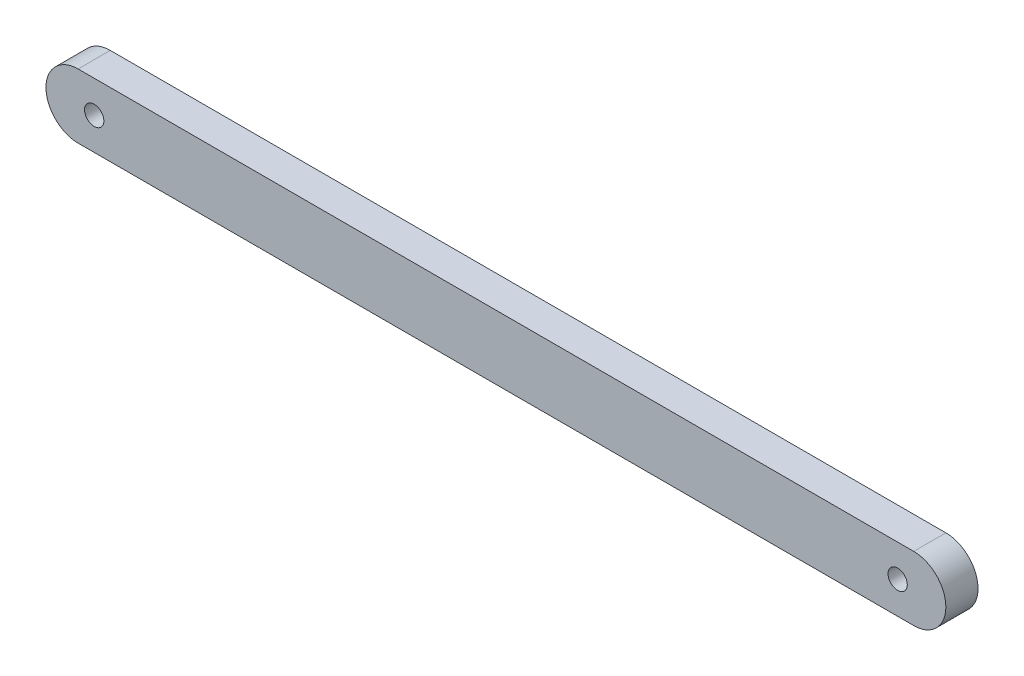
ISO-10303-21;
HEADER;
FILE_DESCRIPTION(('STEP AP214'),'2;1');
FILE_NAME('part.step','',(''),(''),'','','');
FILE_SCHEMA(('AUTOMOTIVE_DESIGN { 1 0 10303 214 1 1 1 1 }'));
ENDSEC;
DATA;
#1=APPLICATION_CONTEXT('core data for automotive mechanical design processes');
#2=APPLICATION_PROTOCOL_DEFINITION('international standard','automotive_design',2000,#1);
#3=PRODUCT_CONTEXT('',#1,'mechanical');
#4=PRODUCT('Part','Part','',(#3));
#5=PRODUCT_RELATED_PRODUCT_CATEGORY('part','',(#4));
#6=PRODUCT_DEFINITION_FORMATION('','',#4);
#7=PRODUCT_DEFINITION_CONTEXT('part definition',#1,'design');
#8=PRODUCT_DEFINITION('design','',#6,#7);
#9=PRODUCT_DEFINITION_SHAPE('','',#8);
#10=(LENGTH_UNIT() NAMED_UNIT(*) SI_UNIT(.MILLI.,.METRE.));
#11=(NAMED_UNIT(*) PLANE_ANGLE_UNIT() SI_UNIT($,.RADIAN.));
#12=(NAMED_UNIT(*) SI_UNIT($,.STERADIAN.) SOLID_ANGLE_UNIT());
#13=UNCERTAINTY_MEASURE_WITH_UNIT(LENGTH_MEASURE(1.E-05),#10,'distance_accuracy_value','');
#14=(GEOMETRIC_REPRESENTATION_CONTEXT(3) GLOBAL_UNCERTAINTY_ASSIGNED_CONTEXT((#13)) GLOBAL_UNIT_ASSIGNED_CONTEXT((#10,
#11,#12)) REPRESENTATION_CONTEXT('',''));
#15=CARTESIAN_POINT('',(0.,0.,0.));
#16=DIRECTION('',(0.,0.,1.));
#17=DIRECTION('',(1.,0.,0.));
#18=AXIS2_PLACEMENT_3D('',#15,#16,#17);
#19=CARTESIAN_POINT('',(-122.628083491461,-18.2258064516129,10.));
#20=DIRECTION('',(0.,0.,-1.));
#21=DIRECTION('',(-1.,0.,0.));
#22=AXIS2_PLACEMENT_3D('',#19,#20,#21);
#23=PLANE('',#22);
#24=CARTESIAN_POINT('',(-122.628083491461,-18.2258064516129,10.));
#25=DIRECTION('',(0.,0.,1.));
#26=DIRECTION('',(-1.,0.,0.));
#27=AXIS2_PLACEMENT_3D('',#24,#25,#26);
#28=CIRCLE('',#27,10.);
#29=CARTESIAN_POINT('',(-122.628083491461,-8.22580645161288,10.));
#30=VERTEX_POINT('',#29);
#31=CARTESIAN_POINT('',(-122.628083491461,-28.2258064516129,10.));
#32=VERTEX_POINT('',#31);
#33=EDGE_CURVE('E85',#30,#32,#28,.T.);
#34=ORIENTED_EDGE('',*,*,#33,.T.);
#35=DIRECTION('',(1.,0.,0.));
#36=VECTOR('',#35,1.);
#37=CARTESIAN_POINT('',(-122.628083491461,-28.2258064516129,10.));
#38=LINE('',#37,#36);
#39=CARTESIAN_POINT('',(137.371916508539,-28.2258064516129,10.));
#40=VERTEX_POINT('',#39);
#41=EDGE_CURVE('E80',#32,#40,#38,.T.);
#42=ORIENTED_EDGE('',*,*,#41,.T.);
#43=CARTESIAN_POINT('',(137.371916508539,-18.2258064516129,10.));
#44=DIRECTION('',(0.,0.,1.));
#45=DIRECTION('',(1.,0.,0.));
#46=AXIS2_PLACEMENT_3D('',#43,#44,#45);
#47=CIRCLE('',#46,10.);
#48=CARTESIAN_POINT('',(137.371916508539,-8.22580645161288,10.));
#49=VERTEX_POINT('',#48);
#50=EDGE_CURVE('E83',#40,#49,#47,.T.);
#51=ORIENTED_EDGE('',*,*,#50,.T.);
#52=DIRECTION('',(-1.,0.,0.));
#53=VECTOR('',#52,1.);
#54=CARTESIAN_POINT('',(-122.628083491461,-8.22580645161288,10.));
#55=LINE('',#54,#53);
#56=EDGE_CURVE('E50',#49,#30,#55,.T.);
#57=ORIENTED_EDGE('',*,*,#56,.T.);
#58=EDGE_LOOP('',(#34,#42,#51,#57));
#59=FACE_BOUND('',#58,.T.);
#60=CARTESIAN_POINT('',(-117.628083491461,-18.2258064516129,10.));
#61=DIRECTION('',(0.,0.,1.));
#62=DIRECTION('',(1.,0.,0.));
#63=AXIS2_PLACEMENT_3D('',#60,#61,#62);
#64=CIRCLE('',#63,3.00000000000001);
#65=CARTESIAN_POINT('',(-114.628083491461,-18.2258064516129,10.));
#66=VERTEX_POINT('',#65);
#67=EDGE_CURVE('E100',#66,#66,#64,.T.);
#68=ORIENTED_EDGE('',*,*,#67,.F.);
#69=EDGE_LOOP('',(#68));
#70=FACE_BOUND('',#69,.T.);
#71=CARTESIAN_POINT('',(132.371916508539,-18.2258064516129,10.));
#72=DIRECTION('',(0.,0.,1.));
#73=DIRECTION('',(1.,0.,0.));
#74=AXIS2_PLACEMENT_3D('',#71,#72,#73);
#75=CIRCLE('',#74,2.99999999999999);
#76=CARTESIAN_POINT('',(135.371916508539,-18.2258064516129,10.));
#77=VERTEX_POINT('',#76);
#78=EDGE_CURVE('E115',#77,#77,#75,.T.);
#79=ORIENTED_EDGE('',*,*,#78,.F.);
#80=EDGE_LOOP('',(#79));
#81=FACE_BOUND('',#80,.T.);
#82=ADVANCED_FACE('F33',(#59,#70,#81),#23,.F.);
#83=CARTESIAN_POINT('',(-122.628083491461,-18.2258064516129,0.));
#84=DIRECTION('',(0.,0.,-1.));
#85=DIRECTION('',(-1.,0.,0.));
#86=AXIS2_PLACEMENT_3D('',#83,#84,#85);
#87=PLANE('',#86);
#88=CARTESIAN_POINT('',(-117.628083491461,-18.2258064516129,0.));
#89=DIRECTION('',(0.,0.,1.));
#90=DIRECTION('',(1.,0.,0.));
#91=AXIS2_PLACEMENT_3D('',#88,#89,#90);
#92=CIRCLE('',#91,3.00000000000001);
#93=CARTESIAN_POINT('',(-114.628083491461,-18.2258064516129,0.));
#94=VERTEX_POINT('',#93);
#95=EDGE_CURVE('E112',#94,#94,#92,.T.);
#96=ORIENTED_EDGE('',*,*,#95,.T.);
#97=EDGE_LOOP('',(#96));
#98=FACE_BOUND('',#97,.T.);
#99=CARTESIAN_POINT('',(-122.628083491461,-18.2258064516129,0.));
#100=DIRECTION('',(0.,0.,1.));
#101=DIRECTION('',(-1.,0.,0.));
#102=AXIS2_PLACEMENT_3D('',#99,#100,#101);
#103=CIRCLE('',#102,10.);
#104=CARTESIAN_POINT('',(-122.628083491461,-8.22580645161288,0.));
#105=VERTEX_POINT('',#104);
#106=CARTESIAN_POINT('',(-122.628083491461,-28.2258064516129,0.));
#107=VERTEX_POINT('',#106);
#108=EDGE_CURVE('E97',#105,#107,#103,.T.);
#109=ORIENTED_EDGE('',*,*,#108,.F.);
#110=DIRECTION('',(-1.,0.,0.));
#111=VECTOR('',#110,1.);
#112=CARTESIAN_POINT('',(-122.628083491461,-8.22580645161288,0.));
#113=LINE('',#112,#111);
#114=CARTESIAN_POINT('',(137.371916508539,-8.22580645161288,0.));
#115=VERTEX_POINT('',#114);
#116=EDGE_CURVE('E73',#115,#105,#113,.T.);
#117=ORIENTED_EDGE('',*,*,#116,.F.);
#118=CARTESIAN_POINT('',(137.371916508539,-18.2258064516129,0.));
#119=DIRECTION('',(0.,0.,1.));
#120=DIRECTION('',(1.,0.,0.));
#121=AXIS2_PLACEMENT_3D('',#118,#119,#120);
#122=CIRCLE('',#121,10.);
#123=CARTESIAN_POINT('',(137.371916508539,-28.2258064516129,0.));
#124=VERTEX_POINT('',#123);
#125=EDGE_CURVE('E67',#124,#115,#122,.T.);
#126=ORIENTED_EDGE('',*,*,#125,.F.);
#127=DIRECTION('',(1.,0.,0.));
#128=VECTOR('',#127,1.);
#129=CARTESIAN_POINT('',(-122.628083491461,-28.2258064516129,0.));
#130=LINE('',#129,#128);
#131=EDGE_CURVE('E89',#107,#124,#130,.T.);
#132=ORIENTED_EDGE('',*,*,#131,.F.);
#133=EDGE_LOOP('',(#109,#117,#126,#132));
#134=FACE_BOUND('',#133,.T.);
#135=CARTESIAN_POINT('',(132.371916508539,-18.2258064516129,0.));
#136=DIRECTION('',(0.,0.,1.));
#137=DIRECTION('',(1.,0.,0.));
#138=AXIS2_PLACEMENT_3D('',#135,#136,#137);
#139=CIRCLE('',#138,2.99999999999999);
#140=CARTESIAN_POINT('',(135.371916508539,-18.2258064516129,0.));
#141=VERTEX_POINT('',#140);
#142=EDGE_CURVE('E118',#141,#141,#139,.T.);
#143=ORIENTED_EDGE('',*,*,#142,.T.);
#144=EDGE_LOOP('',(#143));
#145=FACE_BOUND('',#144,.T.);
#146=ADVANCED_FACE('F108',(#98,#134,#145),#87,.T.);
#147=CARTESIAN_POINT('',(-122.628083491461,-18.2258064516129,10.));
#148=DIRECTION('',(0.,0.,-1.));
#149=DIRECTION('',(-1.,0.,0.));
#150=AXIS2_PLACEMENT_3D('',#147,#148,#149);
#151=CYLINDRICAL_SURFACE('',#150,10.);
#152=ORIENTED_EDGE('',*,*,#108,.T.);
#153=DIRECTION('',(0.,0.,-1.));
#154=VECTOR('',#153,1.);
#155=CARTESIAN_POINT('',(-122.628083491461,-28.2258064516129,10.));
#156=LINE('',#155,#154);
#157=EDGE_CURVE('E11',#32,#107,#156,.T.);
#158=ORIENTED_EDGE('',*,*,#157,.F.);
#159=ORIENTED_EDGE('',*,*,#33,.F.);
#160=DIRECTION('',(0.,0.,-1.));
#161=VECTOR('',#160,1.);
#162=CARTESIAN_POINT('',(-122.628083491461,-8.22580645161288,10.));
#163=LINE('',#162,#161);
#164=EDGE_CURVE('E93',#30,#105,#163,.T.);
#165=ORIENTED_EDGE('',*,*,#164,.T.);
#166=EDGE_LOOP('',(#152,#158,#159,#165));
#167=FACE_BOUND('',#166,.T.);
#168=ADVANCED_FACE('F35',(#167),#151,.T.);
#169=CARTESIAN_POINT('',(-122.628083491461,-28.2258064516129,10.));
#170=DIRECTION('',(0.,1.,0.));
#171=DIRECTION('',(0.,0.,1.));
#172=AXIS2_PLACEMENT_3D('',#169,#170,#171);
#173=PLANE('',#172);
#174=ORIENTED_EDGE('',*,*,#131,.T.);
#175=DIRECTION('',(0.,0.,-1.));
#176=VECTOR('',#175,1.);
#177=CARTESIAN_POINT('',(137.371916508539,-28.2258064516129,10.));
#178=LINE('',#177,#176);
#179=EDGE_CURVE('E42',#40,#124,#178,.T.);
#180=ORIENTED_EDGE('',*,*,#179,.F.);
#181=ORIENTED_EDGE('',*,*,#41,.F.);
#182=ORIENTED_EDGE('',*,*,#157,.T.);
#183=EDGE_LOOP('',(#174,#180,#181,#182));
#184=FACE_BOUND('',#183,.T.);
#185=ADVANCED_FACE('F88',(#184),#173,.F.);
#186=CARTESIAN_POINT('',(137.371916508539,-18.2258064516129,10.));
#187=DIRECTION('',(0.,0.,-1.));
#188=DIRECTION('',(-1.,0.,0.));
#189=AXIS2_PLACEMENT_3D('',#186,#187,#188);
#190=CYLINDRICAL_SURFACE('',#189,10.);
#191=ORIENTED_EDGE('',*,*,#125,.T.);
#192=DIRECTION('',(0.,0.,-1.));
#193=VECTOR('',#192,1.);
#194=CARTESIAN_POINT('',(137.371916508539,-8.22580645161288,10.));
#195=LINE('',#194,#193);
#196=EDGE_CURVE('E90',#49,#115,#195,.T.);
#197=ORIENTED_EDGE('',*,*,#196,.F.);
#198=ORIENTED_EDGE('',*,*,#50,.F.);
#199=ORIENTED_EDGE('',*,*,#179,.T.);
#200=EDGE_LOOP('',(#191,#197,#198,#199));
#201=FACE_BOUND('',#200,.T.);
#202=ADVANCED_FACE('F91',(#201),#190,.T.);
#203=CARTESIAN_POINT('',(-122.628083491461,-8.22580645161288,10.));
#204=DIRECTION('',(0.,-1.,0.));
#205=DIRECTION('',(1.,0.,0.));
#206=AXIS2_PLACEMENT_3D('',#203,#204,#205);
#207=PLANE('',#206);
#208=ORIENTED_EDGE('',*,*,#116,.T.);
#209=ORIENTED_EDGE('',*,*,#164,.F.);
#210=ORIENTED_EDGE('',*,*,#56,.F.);
#211=ORIENTED_EDGE('',*,*,#196,.T.);
#212=EDGE_LOOP('',(#208,#209,#210,#211));
#213=FACE_BOUND('',#212,.T.);
#214=ADVANCED_FACE('F105',(#213),#207,.F.);
#215=CARTESIAN_POINT('',(-117.628083491461,-18.2258064516129,10.));
#216=DIRECTION('',(0.,0.,-1.));
#217=DIRECTION('',(-1.,0.,0.));
#218=AXIS2_PLACEMENT_3D('',#215,#216,#217);
#219=CYLINDRICAL_SURFACE('',#218,3.00000000000001);
#220=ORIENTED_EDGE('',*,*,#67,.T.);
#221=EDGE_LOOP('',(#220));
#222=FACE_BOUND('',#221,.T.);
#223=ORIENTED_EDGE('',*,*,#95,.F.);
#224=EDGE_LOOP('',(#223));
#225=FACE_BOUND('',#224,.T.);
#226=ADVANCED_FACE('F135',(#222,#225),#219,.F.);
#227=CARTESIAN_POINT('',(132.371916508539,-18.2258064516129,10.));
#228=DIRECTION('',(0.,0.,-1.));
#229=DIRECTION('',(-1.,0.,0.));
#230=AXIS2_PLACEMENT_3D('',#227,#228,#229);
#231=CYLINDRICAL_SURFACE('',#230,2.99999999999999);
#232=ORIENTED_EDGE('',*,*,#78,.T.);
#233=EDGE_LOOP('',(#232));
#234=FACE_BOUND('',#233,.T.);
#235=ORIENTED_EDGE('',*,*,#142,.F.);
#236=EDGE_LOOP('',(#235));
#237=FACE_BOUND('',#236,.T.);
#238=ADVANCED_FACE('F124',(#234,#237),#231,.F.);
#239=CLOSED_SHELL('',(#82,#146,#168,#185,#202,#214,#226,#238));
#240=MANIFOLD_SOLID_BREP('B2',#239);
#241=ADVANCED_BREP_SHAPE_REPRESENTATION('',(#18,#240),#14);
#242=SHAPE_DEFINITION_REPRESENTATION(#9,#241);
ENDSEC;
END-ISO-10303-21;
